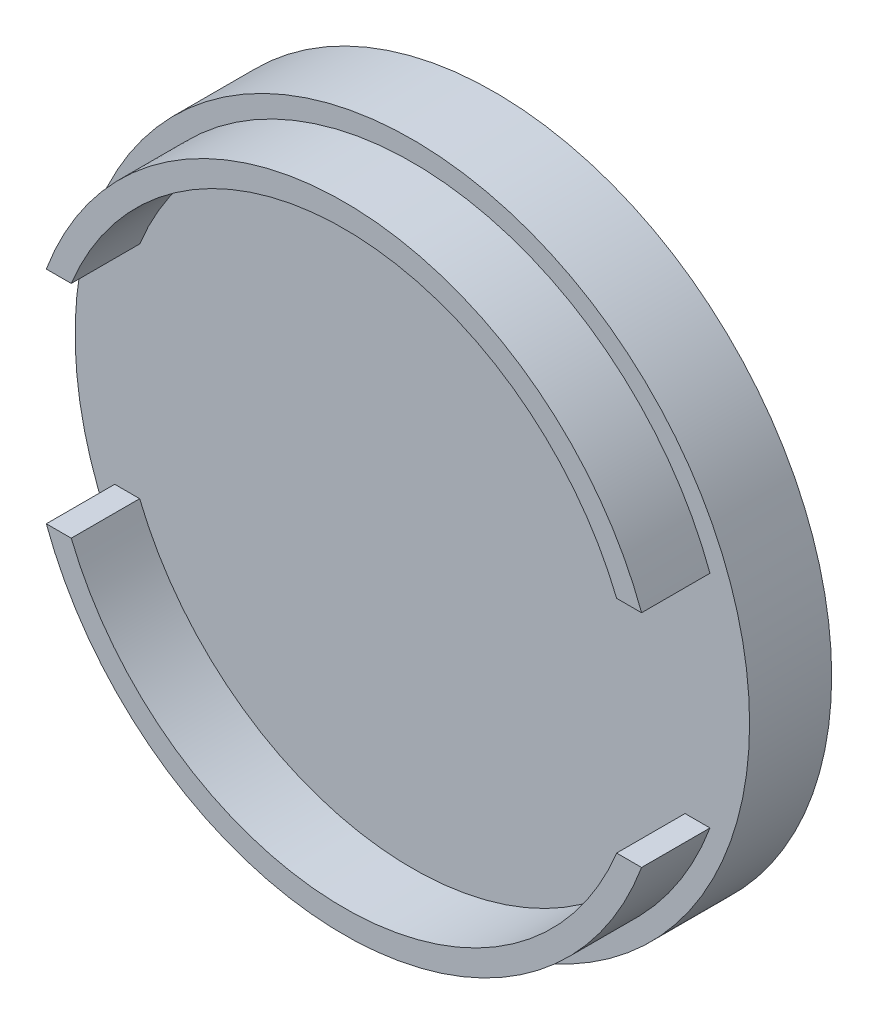
ISO-10303-21;
HEADER;
FILE_DESCRIPTION(('STEP AP214'),'2;1');
FILE_NAME('part.step','',(''),(''),'','','');
FILE_SCHEMA(('AUTOMOTIVE_DESIGN { 1 0 10303 214 1 1 1 1 }'));
ENDSEC;
DATA;
#1=APPLICATION_CONTEXT('core data for automotive mechanical design processes');
#2=APPLICATION_PROTOCOL_DEFINITION('international standard','automotive_design',2000,#1);
#3=PRODUCT_CONTEXT('',#1,'mechanical');
#4=PRODUCT('Part','Part','',(#3));
#5=PRODUCT_RELATED_PRODUCT_CATEGORY('part','',(#4));
#6=PRODUCT_DEFINITION_FORMATION('','',#4);
#7=PRODUCT_DEFINITION_CONTEXT('part definition',#1,'design');
#8=PRODUCT_DEFINITION('design','',#6,#7);
#9=PRODUCT_DEFINITION_SHAPE('','',#8);
#10=(LENGTH_UNIT() NAMED_UNIT(*) SI_UNIT(.MILLI.,.METRE.));
#11=(NAMED_UNIT(*) PLANE_ANGLE_UNIT() SI_UNIT($,.RADIAN.));
#12=(NAMED_UNIT(*) SI_UNIT($,.STERADIAN.) SOLID_ANGLE_UNIT());
#13=UNCERTAINTY_MEASURE_WITH_UNIT(LENGTH_MEASURE(1.E-05),#10,'distance_accuracy_value','');
#14=(GEOMETRIC_REPRESENTATION_CONTEXT(3) GLOBAL_UNCERTAINTY_ASSIGNED_CONTEXT((#13)) GLOBAL_UNIT_ASSIGNED_CONTEXT((#10,
#11,#12)) REPRESENTATION_CONTEXT('',''));
#15=CARTESIAN_POINT('',(0.,0.,0.));
#16=DIRECTION('',(0.,0.,1.));
#17=DIRECTION('',(1.,0.,0.));
#18=AXIS2_PLACEMENT_3D('',#15,#16,#17);
#19=CARTESIAN_POINT('',(0.,0.,11.));
#20=DIRECTION('',(0.,0.,1.));
#21=DIRECTION('',(1.,0.,0.));
#22=AXIS2_PLACEMENT_3D('',#19,#20,#21);
#23=PLANE('',#22);
#24=DIRECTION('',(-1.,0.,0.));
#25=VECTOR('',#24,1.);
#26=CARTESIAN_POINT('',(-21.7545995019859,8.06085606546804,11.));
#27=LINE('',#26,#25);
#28=CARTESIAN_POINT('',(-19.9316983594426,8.06085606546804,11.));
#29=VERTEX_POINT('',#28);
#30=CARTESIAN_POINT('',(-21.7545995019859,8.06085606546804,11.));
#31=VERTEX_POINT('',#30);
#32=EDGE_CURVE('E105',#29,#31,#27,.T.);
#33=ORIENTED_EDGE('',*,*,#32,.F.);
#34=CARTESIAN_POINT('',(0.,0.,11.));
#35=DIRECTION('',(0.,0.,1.));
#36=DIRECTION('',(1.,0.,0.));
#37=AXIS2_PLACEMENT_3D('',#34,#35,#36);
#38=CIRCLE('',#37,21.5);
#39=CARTESIAN_POINT('',(19.9316983594426,8.06085606546804,11.));
#40=VERTEX_POINT('',#39);
#41=EDGE_CURVE('E120',#40,#29,#38,.T.);
#42=ORIENTED_EDGE('',*,*,#41,.F.);
#43=DIRECTION('',(-1.,0.,0.));
#44=VECTOR('',#43,1.);
#45=CARTESIAN_POINT('',(19.9316983594426,8.06085606546804,11.));
#46=LINE('',#45,#44);
#47=CARTESIAN_POINT('',(21.7545995019859,8.06085606546804,11.));
#48=VERTEX_POINT('',#47);
#49=EDGE_CURVE('E163',#48,#40,#46,.T.);
#50=ORIENTED_EDGE('',*,*,#49,.F.);
#51=CARTESIAN_POINT('',(0.,0.,11.));
#52=DIRECTION('',(0.,0.,1.));
#53=DIRECTION('',(1.,0.,0.));
#54=AXIS2_PLACEMENT_3D('',#51,#52,#53);
#55=CIRCLE('',#54,23.2);
#56=EDGE_CURVE('E128',#48,#31,#55,.T.);
#57=ORIENTED_EDGE('',*,*,#56,.T.);
#58=EDGE_LOOP('',(#33,#42,#50,#57));
#59=FACE_BOUND('',#58,.T.);
#60=ADVANCED_FACE('F33',(#59),#23,.T.);
#61=CARTESIAN_POINT('',(0.,0.,11.));
#62=DIRECTION('',(0.,0.,-1.));
#63=DIRECTION('',(-1.,0.,0.));
#64=AXIS2_PLACEMENT_3D('',#61,#62,#63);
#65=CYLINDRICAL_SURFACE('',#64,23.2);
#66=CARTESIAN_POINT('',(0.,0.,6.));
#67=DIRECTION('',(0.,0.,1.));
#68=DIRECTION('',(1.,0.,0.));
#69=AXIS2_PLACEMENT_3D('',#66,#67,#68);
#70=CIRCLE('',#69,23.2);
#71=CARTESIAN_POINT('',(21.7545995019859,8.06085606546804,6.));
#72=VERTEX_POINT('',#71);
#73=CARTESIAN_POINT('',(-21.7545995019859,8.06085606546804,6.));
#74=VERTEX_POINT('',#73);
#75=EDGE_CURVE('E119',#72,#74,#70,.T.);
#76=ORIENTED_EDGE('',*,*,#75,.T.);
#77=DIRECTION('',(0.,0.,1.));
#78=VECTOR('',#77,1.);
#79=CARTESIAN_POINT('',(-21.7545995019859,8.06085606546804,6.));
#80=LINE('',#79,#78);
#81=EDGE_CURVE('E154',#74,#31,#80,.T.);
#82=ORIENTED_EDGE('',*,*,#81,.T.);
#83=ORIENTED_EDGE('',*,*,#56,.F.);
#84=DIRECTION('',(0.,0.,1.));
#85=VECTOR('',#84,1.);
#86=CARTESIAN_POINT('',(21.7545995019859,8.06085606546804,6.));
#87=LINE('',#86,#85);
#88=EDGE_CURVE('E162',#72,#48,#87,.T.);
#89=ORIENTED_EDGE('',*,*,#88,.F.);
#90=EDGE_LOOP('',(#76,#82,#83,#89));
#91=FACE_BOUND('',#90,.T.);
#92=ADVANCED_FACE('F175',(#91),#65,.T.);
#93=CARTESIAN_POINT('',(0.,0.,11.));
#94=DIRECTION('',(0.,0.,-1.));
#95=DIRECTION('',(-1.,0.,0.));
#96=AXIS2_PLACEMENT_3D('',#93,#94,#95);
#97=CYLINDRICAL_SURFACE('',#96,21.5);
#98=DIRECTION('',(0.,0.,1.));
#99=VECTOR('',#98,1.);
#100=CARTESIAN_POINT('',(-19.9316983594426,8.06085606546804,6.));
#101=LINE('',#100,#99);
#102=CARTESIAN_POINT('',(-19.9316983594426,8.06085606546804,6.));
#103=VERTEX_POINT('',#102);
#104=EDGE_CURVE('E157',#103,#29,#101,.T.);
#105=ORIENTED_EDGE('',*,*,#104,.F.);
#106=CARTESIAN_POINT('',(0.,0.,6.));
#107=DIRECTION('',(0.,0.,1.));
#108=DIRECTION('',(1.,0.,0.));
#109=AXIS2_PLACEMENT_3D('',#106,#107,#108);
#110=CIRCLE('',#109,21.5);
#111=CARTESIAN_POINT('',(19.9316983594426,8.06085606546804,6.));
#112=VERTEX_POINT('',#111);
#113=EDGE_CURVE('E41',#103,#112,#110,.F.);
#114=ORIENTED_EDGE('',*,*,#113,.T.);
#115=DIRECTION('',(0.,0.,1.));
#116=VECTOR('',#115,1.);
#117=CARTESIAN_POINT('',(19.9316983594426,8.06085606546804,6.));
#118=LINE('',#117,#116);
#119=EDGE_CURVE('E167',#112,#40,#118,.T.);
#120=ORIENTED_EDGE('',*,*,#119,.T.);
#121=ORIENTED_EDGE('',*,*,#41,.T.);
#122=EDGE_LOOP('',(#105,#114,#120,#121));
#123=FACE_BOUND('',#122,.T.);
#124=ADVANCED_FACE('F183',(#123),#97,.F.);
#125=CARTESIAN_POINT('',(0.,0.,6.));
#126=DIRECTION('',(0.,0.,-1.));
#127=DIRECTION('',(-1.,0.,0.));
#128=AXIS2_PLACEMENT_3D('',#125,#126,#127);
#129=CYLINDRICAL_SURFACE('',#128,24.65);
#130=CARTESIAN_POINT('',(0.,0.,6.));
#131=DIRECTION('',(0.,0.,1.));
#132=DIRECTION('',(1.,0.,0.));
#133=AXIS2_PLACEMENT_3D('',#130,#131,#132);
#134=CIRCLE('',#133,24.65);
#135=CARTESIAN_POINT('',(24.65,0.,6.));
#136=VERTEX_POINT('',#135);
#137=EDGE_CURVE('E129',#136,#136,#134,.T.);
#138=ORIENTED_EDGE('',*,*,#137,.F.);
#139=EDGE_LOOP('',(#138));
#140=FACE_BOUND('',#139,.T.);
#141=CARTESIAN_POINT('',(0.,0.,0.));
#142=DIRECTION('',(0.,0.,1.));
#143=DIRECTION('',(1.,0.,0.));
#144=AXIS2_PLACEMENT_3D('',#141,#142,#143);
#145=CIRCLE('',#144,24.65);
#146=CARTESIAN_POINT('',(24.65,0.,0.));
#147=VERTEX_POINT('',#146);
#148=EDGE_CURVE('E131',#147,#147,#145,.T.);
#149=ORIENTED_EDGE('',*,*,#148,.T.);
#150=EDGE_LOOP('',(#149));
#151=FACE_BOUND('',#150,.T.);
#152=ADVANCED_FACE('F35',(#140,#151),#129,.T.);
#153=CARTESIAN_POINT('',(0.,0.,6.));
#154=DIRECTION('',(0.,0.,1.));
#155=DIRECTION('',(1.,0.,0.));
#156=AXIS2_PLACEMENT_3D('',#153,#154,#155);
#157=PLANE('',#156);
#158=CARTESIAN_POINT('',(-21.7545995019859,-8.06085606546804,6.));
#159=VERTEX_POINT('',#158);
#160=CARTESIAN_POINT('',(21.7545995019859,-8.06085606546804,6.));
#161=VERTEX_POINT('',#160);
#162=EDGE_CURVE('E112',#159,#161,#70,.T.);
#163=ORIENTED_EDGE('',*,*,#162,.F.);
#164=DIRECTION('',(1.,0.,0.));
#165=VECTOR('',#164,1.);
#166=CARTESIAN_POINT('',(-19.9316983594426,-8.06085606546804,6.));
#167=LINE('',#166,#165);
#168=CARTESIAN_POINT('',(-19.9316983594426,-8.06085606546804,6.));
#169=VERTEX_POINT('',#168);
#170=EDGE_CURVE('E56',#159,#169,#167,.T.);
#171=ORIENTED_EDGE('',*,*,#170,.T.);
#172=CARTESIAN_POINT('',(19.9316983594426,-8.06085606546804,6.));
#173=VERTEX_POINT('',#172);
#174=EDGE_CURVE('E11',#173,#169,#110,.F.);
#175=ORIENTED_EDGE('',*,*,#174,.F.);
#176=DIRECTION('',(1.,0.,0.));
#177=VECTOR('',#176,1.);
#178=CARTESIAN_POINT('',(21.7545995019859,-8.06085606546804,6.));
#179=LINE('',#178,#177);
#180=EDGE_CURVE('E118',#173,#161,#179,.T.);
#181=ORIENTED_EDGE('',*,*,#180,.T.);
#182=EDGE_LOOP('',(#163,#171,#175,#181));
#183=FACE_BOUND('',#182,.T.);
#184=ORIENTED_EDGE('',*,*,#75,.F.);
#185=DIRECTION('',(-1.,0.,0.));
#186=VECTOR('',#185,1.);
#187=CARTESIAN_POINT('',(19.9316983594426,8.06085606546804,6.));
#188=LINE('',#187,#186);
#189=EDGE_CURVE('E48',#72,#112,#188,.T.);
#190=ORIENTED_EDGE('',*,*,#189,.T.);
#191=ORIENTED_EDGE('',*,*,#113,.F.);
#192=DIRECTION('',(-1.,0.,0.));
#193=VECTOR('',#192,1.);
#194=CARTESIAN_POINT('',(-21.7545995019859,8.06085606546804,6.));
#195=LINE('',#194,#193);
#196=EDGE_CURVE('E104',#103,#74,#195,.T.);
#197=ORIENTED_EDGE('',*,*,#196,.T.);
#198=EDGE_LOOP('',(#184,#190,#191,#197));
#199=FACE_BOUND('',#198,.T.);
#200=ORIENTED_EDGE('',*,*,#137,.T.);
#201=EDGE_LOOP('',(#200));
#202=FACE_BOUND('',#201,.T.);
#203=ADVANCED_FACE('F117',(#183,#199,#202),#157,.T.);
#204=CARTESIAN_POINT('',(0.,0.,0.));
#205=DIRECTION('',(0.,0.,1.));
#206=DIRECTION('',(1.,0.,0.));
#207=AXIS2_PLACEMENT_3D('',#204,#205,#206);
#208=PLANE('',#207);
#209=ORIENTED_EDGE('',*,*,#148,.F.);
#210=EDGE_LOOP('',(#209));
#211=FACE_BOUND('',#210,.T.);
#212=ADVANCED_FACE('F202',(#211),#208,.F.);
#213=DIRECTION('',(1.,0.,0.));
#214=VECTOR('',#213,1.);
#215=CARTESIAN_POINT('',(-19.9316983594426,-8.06085606546804,11.));
#216=LINE('',#215,#214);
#217=CARTESIAN_POINT('',(-21.7545995019859,-8.06085606546804,11.));
#218=VERTEX_POINT('',#217);
#219=CARTESIAN_POINT('',(-19.9316983594426,-8.06085606546804,11.));
#220=VERTEX_POINT('',#219);
#221=EDGE_CURVE('E146',#218,#220,#216,.T.);
#222=ORIENTED_EDGE('',*,*,#221,.F.);
#223=CARTESIAN_POINT('',(21.7545995019859,-8.06085606546804,11.));
#224=VERTEX_POINT('',#223);
#225=EDGE_CURVE('E114',#218,#224,#55,.T.);
#226=ORIENTED_EDGE('',*,*,#225,.T.);
#227=DIRECTION('',(1.,0.,0.));
#228=VECTOR('',#227,1.);
#229=CARTESIAN_POINT('',(21.7545995019859,-8.06085606546804,11.));
#230=LINE('',#229,#228);
#231=CARTESIAN_POINT('',(19.9316983594426,-8.06085606546804,11.));
#232=VERTEX_POINT('',#231);
#233=EDGE_CURVE('E144',#232,#224,#230,.T.);
#234=ORIENTED_EDGE('',*,*,#233,.F.);
#235=EDGE_CURVE('E124',#220,#232,#38,.T.);
#236=ORIENTED_EDGE('',*,*,#235,.F.);
#237=EDGE_LOOP('',(#222,#226,#234,#236));
#238=FACE_BOUND('',#237,.T.);
#239=ADVANCED_FACE('F142',(#238),#23,.T.);
#240=ORIENTED_EDGE('',*,*,#225,.F.);
#241=DIRECTION('',(0.,0.,1.));
#242=VECTOR('',#241,1.);
#243=CARTESIAN_POINT('',(-21.7545995019859,-8.06085606546804,6.));
#244=LINE('',#243,#242);
#245=EDGE_CURVE('E100',#159,#218,#244,.T.);
#246=ORIENTED_EDGE('',*,*,#245,.F.);
#247=ORIENTED_EDGE('',*,*,#162,.T.);
#248=DIRECTION('',(0.,0.,1.));
#249=VECTOR('',#248,1.);
#250=CARTESIAN_POINT('',(21.7545995019859,-8.06085606546804,6.));
#251=LINE('',#250,#249);
#252=EDGE_CURVE('E147',#161,#224,#251,.T.);
#253=ORIENTED_EDGE('',*,*,#252,.T.);
#254=EDGE_LOOP('',(#240,#246,#247,#253));
#255=FACE_BOUND('',#254,.T.);
#256=ADVANCED_FACE('F110',(#255),#65,.T.);
#257=DIRECTION('',(0.,0.,1.));
#258=VECTOR('',#257,1.);
#259=CARTESIAN_POINT('',(-19.9316983594426,-8.06085606546804,6.));
#260=LINE('',#259,#258);
#261=EDGE_CURVE('E103',#169,#220,#260,.T.);
#262=ORIENTED_EDGE('',*,*,#261,.T.);
#263=ORIENTED_EDGE('',*,*,#235,.T.);
#264=DIRECTION('',(0.,0.,1.));
#265=VECTOR('',#264,1.);
#266=CARTESIAN_POINT('',(19.9316983594426,-8.06085606546804,6.));
#267=LINE('',#266,#265);
#268=EDGE_CURVE('E150',#173,#232,#267,.T.);
#269=ORIENTED_EDGE('',*,*,#268,.F.);
#270=ORIENTED_EDGE('',*,*,#174,.T.);
#271=EDGE_LOOP('',(#262,#263,#269,#270));
#272=FACE_BOUND('',#271,.T.);
#273=ADVANCED_FACE('F186',(#272),#97,.F.);
#274=CARTESIAN_POINT('',(21.7545995019859,-8.06085606546804,6.));
#275=DIRECTION('',(0.,-1.,0.));
#276=DIRECTION('',(0.,0.,-1.));
#277=AXIS2_PLACEMENT_3D('',#274,#275,#276);
#278=PLANE('',#277);
#279=ORIENTED_EDGE('',*,*,#233,.T.);
#280=ORIENTED_EDGE('',*,*,#252,.F.);
#281=ORIENTED_EDGE('',*,*,#180,.F.);
#282=ORIENTED_EDGE('',*,*,#268,.T.);
#283=EDGE_LOOP('',(#279,#280,#281,#282));
#284=FACE_BOUND('',#283,.T.);
#285=ADVANCED_FACE('F196',(#284),#278,.F.);
#286=CARTESIAN_POINT('',(19.9316983594426,8.06085606546804,6.));
#287=DIRECTION('',(0.,1.,0.));
#288=DIRECTION('',(0.,0.,1.));
#289=AXIS2_PLACEMENT_3D('',#286,#287,#288);
#290=PLANE('',#289);
#291=ORIENTED_EDGE('',*,*,#49,.T.);
#292=ORIENTED_EDGE('',*,*,#119,.F.);
#293=ORIENTED_EDGE('',*,*,#189,.F.);
#294=ORIENTED_EDGE('',*,*,#88,.T.);
#295=EDGE_LOOP('',(#291,#292,#293,#294));
#296=FACE_BOUND('',#295,.T.);
#297=ADVANCED_FACE('F172',(#296),#290,.F.);
#298=CARTESIAN_POINT('',(-21.7545995019859,8.06085606546804,6.));
#299=DIRECTION('',(0.,1.,0.));
#300=DIRECTION('',(0.,0.,1.));
#301=AXIS2_PLACEMENT_3D('',#298,#299,#300);
#302=PLANE('',#301);
#303=ORIENTED_EDGE('',*,*,#32,.T.);
#304=ORIENTED_EDGE('',*,*,#81,.F.);
#305=ORIENTED_EDGE('',*,*,#196,.F.);
#306=ORIENTED_EDGE('',*,*,#104,.T.);
#307=EDGE_LOOP('',(#303,#304,#305,#306));
#308=FACE_BOUND('',#307,.T.);
#309=ADVANCED_FACE('F178',(#308),#302,.F.);
#310=CARTESIAN_POINT('',(-19.9316983594426,-8.06085606546804,6.));
#311=DIRECTION('',(0.,-1.,0.));
#312=DIRECTION('',(0.,0.,-1.));
#313=AXIS2_PLACEMENT_3D('',#310,#311,#312);
#314=PLANE('',#313);
#315=ORIENTED_EDGE('',*,*,#221,.T.);
#316=ORIENTED_EDGE('',*,*,#261,.F.);
#317=ORIENTED_EDGE('',*,*,#170,.F.);
#318=ORIENTED_EDGE('',*,*,#245,.T.);
#319=EDGE_LOOP('',(#315,#316,#317,#318));
#320=FACE_BOUND('',#319,.T.);
#321=ADVANCED_FACE('F99',(#320),#314,.F.);
#322=CLOSED_SHELL('',(#60,#92,#124,#152,#203,#212,#239,#256,#273,#285,#297,#309,#321));
#323=MANIFOLD_SOLID_BREP('B2',#322);
#324=ADVANCED_BREP_SHAPE_REPRESENTATION('',(#18,#323),#14);
#325=SHAPE_DEFINITION_REPRESENTATION(#9,#324);
ENDSEC;
END-ISO-10303-21;
